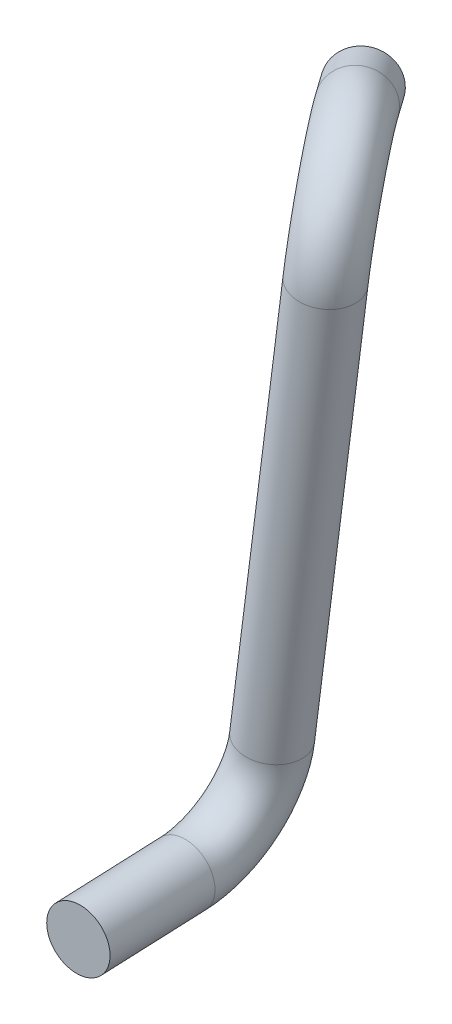
ISO-10303-21;
HEADER;
FILE_DESCRIPTION(('STEP AP214'),'2;1');
FILE_NAME('part.step','',(''),(''),'','','');
FILE_SCHEMA(('AUTOMOTIVE_DESIGN { 1 0 10303 214 1 1 1 1 }'));
ENDSEC;
DATA;
#1=APPLICATION_CONTEXT('core data for automotive mechanical design processes');
#2=APPLICATION_PROTOCOL_DEFINITION('international standard','automotive_design',2000,#1);
#3=PRODUCT_CONTEXT('',#1,'mechanical');
#4=PRODUCT('Part','Part','',(#3));
#5=PRODUCT_RELATED_PRODUCT_CATEGORY('part','',(#4));
#6=PRODUCT_DEFINITION_FORMATION('','',#4);
#7=PRODUCT_DEFINITION_CONTEXT('part definition',#1,'design');
#8=PRODUCT_DEFINITION('design','',#6,#7);
#9=PRODUCT_DEFINITION_SHAPE('','',#8);
#10=(LENGTH_UNIT() NAMED_UNIT(*) SI_UNIT(.MILLI.,.METRE.));
#11=(NAMED_UNIT(*) PLANE_ANGLE_UNIT() SI_UNIT($,.RADIAN.));
#12=(NAMED_UNIT(*) SI_UNIT($,.STERADIAN.) SOLID_ANGLE_UNIT());
#13=UNCERTAINTY_MEASURE_WITH_UNIT(LENGTH_MEASURE(1.E-05),#10,'distance_accuracy_value','');
#14=(GEOMETRIC_REPRESENTATION_CONTEXT(3) GLOBAL_UNCERTAINTY_ASSIGNED_CONTEXT((#13)) GLOBAL_UNIT_ASSIGNED_CONTEXT((#10,
#11,#12)) REPRESENTATION_CONTEXT('',''));
#15=CARTESIAN_POINT('',(0.,0.,0.));
#16=DIRECTION('',(0.,0.,1.));
#17=DIRECTION('',(1.,0.,0.));
#18=AXIS2_PLACEMENT_3D('',#15,#16,#17);
#19=CARTESIAN_POINT('',(-194.078306051018,79.8427734012538,775.906892026204));
#20=DIRECTION('',(-0.604363414205252,-0.210948541666868,-0.768274414736553));
#21=DIRECTION('',(-0.561653761820952,-0.571117933303033,0.598639589479385));
#22=AXIS2_PLACEMENT_3D('',#19,#20,#21);
#23=PLANE('',#22);
#24=CARTESIAN_POINT('',(-194.078306051018,79.8427734012538,775.906892026204));
#25=DIRECTION('',(-0.604363414205252,-0.210948541666868,-0.768274414736553));
#26=DIRECTION('',(-0.561653761820952,-0.571117933303033,0.598639589479385));
#27=AXIS2_PLACEMENT_3D('',#24,#25,#26);
#28=CIRCLE('',#27,7.50000000000001);
#29=CARTESIAN_POINT('',(-198.290709264675,75.559388901481,780.3966889473));
#30=VERTEX_POINT('',#29);
#31=EDGE_CURVE('E65',#30,#30,#28,.T.);
#32=ORIENTED_EDGE('',*,*,#31,.T.);
#33=EDGE_LOOP('',(#32));
#34=FACE_BOUND('',#33,.T.);
#35=ADVANCED_FACE('F43',(#34),#23,.T.);
#36=CARTESIAN_POINT('',(-190.906958024727,-65.1540203862481,849.646951004825));
#37=DIRECTION('',(-0.0489724607211501,-0.00794760958091374,-0.998768508510789));
#38=DIRECTION('',(-0.998800053360937,0.,0.0489740074548744));
#39=AXIS2_PLACEMENT_3D('',#36,#37,#38);
#40=PLANE('',#39);
#41=CARTESIAN_POINT('',(-190.906958024727,-65.1540203862481,849.646951004825));
#42=DIRECTION('',(-0.0489724607211501,-0.00794760958091374,-0.998768508510789));
#43=DIRECTION('',(-0.998800053360937,0.,0.0489740074548744));
#44=AXIS2_PLACEMENT_3D('',#41,#42,#43);
#45=CIRCLE('',#44,7.50000000000001);
#46=CARTESIAN_POINT('',(-198.397958424934,-65.1540203862481,850.014256060736));
#47=VERTEX_POINT('',#46);
#48=EDGE_CURVE('E11',#47,#47,#45,.T.);
#49=ORIENTED_EDGE('',*,*,#48,.F.);
#50=EDGE_LOOP('',(#49));
#51=FACE_BOUND('',#50,.T.);
#52=ADVANCED_FACE('F73',(#51),#40,.F.);
#53=CARTESIAN_POINT('',(-194.078306051018,79.8427734012538,775.906892026204));
#54=DIRECTION('',(0.604363414205253,0.210948541666871,0.768274414736551));
#55=DIRECTION('',(0.785960757903381,0.,-0.61827638401927));
#56=AXIS2_PLACEMENT_3D('',#53,#54,#55);
#57=CYLINDRICAL_SURFACE('',#56,7.50000000000001);
#58=CARTESIAN_POINT('',(-188.809968528046,81.681647316117,782.604069307225));
#59=DIRECTION('',(-0.604363414205252,-0.210948541666868,-0.768274414736553));
#60=DIRECTION('',(-0.561653761820952,-0.571117933303033,0.598639589479385));
#61=AXIS2_PLACEMENT_3D('',#58,#59,#60);
#62=CIRCLE('',#61,7.50000000000001);
#63=CARTESIAN_POINT('',(-189.168963931536,88.9730142434524,780.884449979806));
#64=VERTEX_POINT('',#63);
#65=EDGE_CURVE('E62',#64,#64,#62,.T.);
#66=ORIENTED_EDGE('',*,*,#65,.T.);
#67=EDGE_LOOP('',(#66));
#68=FACE_BOUND('',#67,.T.);
#69=ORIENTED_EDGE('',*,*,#31,.F.);
#70=EDGE_LOOP('',(#69));
#71=FACE_BOUND('',#70,.T.);
#72=ADVANCED_FACE('F70',(#68,#71),#57,.T.);
#73=CARTESIAN_POINT('',(-187.852647452074,62.2380021765558,787.189720847009));
#74=DIRECTION('',(0.795269579742394,-0.101795736579096,-0.597648662301419));
#75=DIRECTION('',(-0.600769466432629,0.,-0.799422321556169));
#76=AXIS2_PLACEMENT_3D('',#73,#74,#75);
#77=TOROIDAL_SURFACE('',#76,20.0000000000001,7.50000000000001);
#78=CARTESIAN_POINT('',(-176.033956965873,60.4366775992491,803.223241513368));
#79=DIRECTION('',(0.135435163509314,0.990719790067956,0.0114723168065581));
#80=DIRECTION('',(-0.986842109561695,0.135919120300188,-0.0875707915497308));
#81=AXIS2_PLACEMENT_3D('',#78,#79,#80);
#82=CIRCLE('',#81,7.50000000000001);
#83=CARTESIAN_POINT('',(-171.601948033547,59.7611808827591,809.235811763253));
#84=VERTEX_POINT('',#83);
#85=EDGE_CURVE('E57',#84,#84,#82,.T.);
#86=CARTESIAN_POINT('',(-187.852647452074,62.2380021765558,787.189720847009));
#87=DIRECTION('',(0.795269579742394,-0.101795736579096,-0.597648662301419));
#88=DIRECTION('',(-0.600769466432629,0.,-0.799422321556169));
#89=AXIS2_PLACEMENT_3D('',#86,#87,#88);
#90=CIRCLE('',#89,27.5000000000001);
#91=EDGE_CURVE('',#64,#84,#90,.T.);
#92=ORIENTED_EDGE('',*,*,#65,.F.);
#93=ORIENTED_EDGE('',*,*,#85,.T.);
#94=ORIENTED_EDGE('',*,*,#91,.T.);
#95=ORIENTED_EDGE('',*,*,#91,.F.);
#96=EDGE_LOOP('',(#92,#94,#93,#95));
#97=FACE_BOUND('',#96,.T.);
#98=ADVANCED_FACE('F72',(#97),#77,.T.);
#99=CARTESIAN_POINT('',(-176.033956965877,60.4366775992494,803.223241513371));
#100=DIRECTION('',(-0.135435163509227,-0.990719790067968,-0.0114723168065756));
#101=DIRECTION('',(0.990784992827673,-0.135444076974478,0.));
#102=AXIS2_PLACEMENT_3D('',#99,#100,#101);
#103=CYLINDRICAL_SURFACE('',#102,7.50000000000001);
#104=CARTESIAN_POINT('',(-190.474798965664,-45.1993151793899,801.999999999996));
#105=DIRECTION('',(0.13543516350923,0.990719790067968,0.0114723168065768));
#106=DIRECTION('',(-0.986842109561706,0.135919120300106,-0.0875707915497319));
#107=AXIS2_PLACEMENT_3D('',#104,#105,#106);
#108=CIRCLE('',#107,7.50000000000001);
#109=CARTESIAN_POINT('',(-190.815833461277,-45.0659496977262,794.508944725797));
#110=VERTEX_POINT('',#109);
#111=EDGE_CURVE('E53',#110,#110,#108,.T.);
#112=ORIENTED_EDGE('',*,*,#111,.T.);
#113=EDGE_LOOP('',(#112));
#114=FACE_BOUND('',#113,.T.);
#115=ORIENTED_EDGE('',*,*,#85,.F.);
#116=EDGE_LOOP('',(#115));
#117=FACE_BOUND('',#116,.T.);
#118=ADVANCED_FACE('F80',(#114,#117),#103,.T.);
#119=CARTESIAN_POINT('',(-189.565373644032,-45.5549564638265,821.976147397859));
#120=DIRECTION('',(-0.989742229293137,0.134751978685672,0.0474575999619311));
#121=DIRECTION('',(-0.134903981298194,-0.990858676012829,0.));
#122=AXIS2_PLACEMENT_3D('',#119,#120,#121);
#123=TOROIDAL_SURFACE('',#122,20.,7.50000000000001);
#124=CARTESIAN_POINT('',(-192.249550810099,-65.3719061760524,822.265451813969));
#125=DIRECTION('',(-0.0489724607211501,-0.00794760958091374,-0.998768508510789));
#126=DIRECTION('',(-0.998800053360937,0.,0.0489740074548744));
#127=AXIS2_PLACEMENT_3D('',#124,#125,#126);
#128=CIRCLE('',#127,7.50000000000001);
#129=CARTESIAN_POINT('',(-193.25611724737,-72.8032623181061,822.37394097001));
#130=VERTEX_POINT('',#129);
#131=EDGE_CURVE('E49',#130,#130,#128,.T.);
#132=CARTESIAN_POINT('',(-189.565373644032,-45.5549564638265,821.976147397859));
#133=DIRECTION('',(-0.989742229293137,0.134751978685672,0.0474575999619311));
#134=DIRECTION('',(-0.134903981298194,-0.990858676012829,0.));
#135=AXIS2_PLACEMENT_3D('',#132,#133,#134);
#136=CIRCLE('',#135,27.5);
#137=EDGE_CURVE('',#110,#130,#136,.T.);
#138=ORIENTED_EDGE('',*,*,#111,.F.);
#139=ORIENTED_EDGE('',*,*,#131,.T.);
#140=ORIENTED_EDGE('',*,*,#137,.T.);
#141=ORIENTED_EDGE('',*,*,#137,.F.);
#142=EDGE_LOOP('',(#138,#140,#139,#141));
#143=FACE_BOUND('',#142,.T.);
#144=ADVANCED_FACE('F86',(#143),#123,.T.);
#145=CARTESIAN_POINT('',(-192.249550809924,-65.3719061760526,822.265451814009));
#146=DIRECTION('',(0.048972460721153,0.00794760958091465,0.998768508510788));
#147=DIRECTION('',(0.998800053360937,0.,-0.0489740074548773));
#148=AXIS2_PLACEMENT_3D('',#145,#146,#147);
#149=CYLINDRICAL_SURFACE('',#148,7.50000000000001);
#150=ORIENTED_EDGE('',*,*,#48,.T.);
#151=EDGE_LOOP('',(#150));
#152=FACE_BOUND('',#151,.T.);
#153=ORIENTED_EDGE('',*,*,#131,.F.);
#154=EDGE_LOOP('',(#153));
#155=FACE_BOUND('',#154,.T.);
#156=ADVANCED_FACE('F84',(#152,#155),#149,.T.);
#157=CLOSED_SHELL('',(#35,#52,#72,#98,#118,#144,#156));
#158=MANIFOLD_SOLID_BREP('B2',#157);
#159=ADVANCED_BREP_SHAPE_REPRESENTATION('',(#18,#158),#14);
#160=SHAPE_DEFINITION_REPRESENTATION(#9,#159);
ENDSEC;
END-ISO-10303-21;
